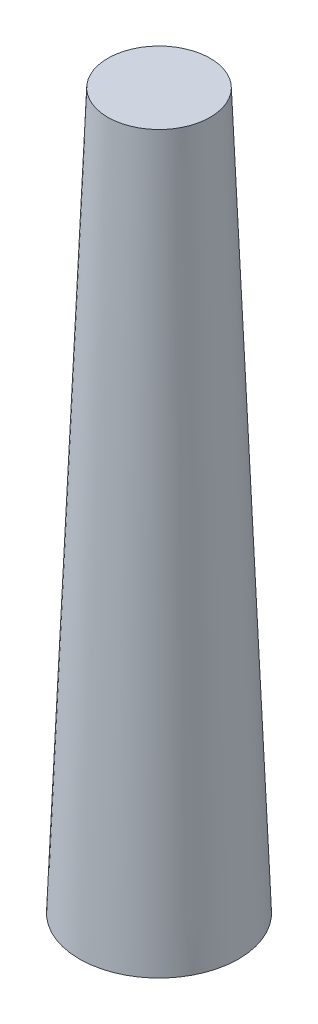
ISO-10303-21;
HEADER;
FILE_DESCRIPTION(('STEP AP214'),'2;1');
FILE_NAME('part.step','',(''),(''),'','','');
FILE_SCHEMA(('AUTOMOTIVE_DESIGN { 1 0 10303 214 1 1 1 1 }'));
ENDSEC;
DATA;
#1=APPLICATION_CONTEXT('core data for automotive mechanical design processes');
#2=APPLICATION_PROTOCOL_DEFINITION('international standard','automotive_design',2000,#1);
#3=PRODUCT_CONTEXT('',#1,'mechanical');
#4=PRODUCT('Part','Part','',(#3));
#5=PRODUCT_RELATED_PRODUCT_CATEGORY('part','',(#4));
#6=PRODUCT_DEFINITION_FORMATION('','',#4);
#7=PRODUCT_DEFINITION_CONTEXT('part definition',#1,'design');
#8=PRODUCT_DEFINITION('design','',#6,#7);
#9=PRODUCT_DEFINITION_SHAPE('','',#8);
#10=(LENGTH_UNIT() NAMED_UNIT(*) SI_UNIT(.MILLI.,.METRE.));
#11=(NAMED_UNIT(*) PLANE_ANGLE_UNIT() SI_UNIT($,.RADIAN.));
#12=(NAMED_UNIT(*) SI_UNIT($,.STERADIAN.) SOLID_ANGLE_UNIT());
#13=UNCERTAINTY_MEASURE_WITH_UNIT(LENGTH_MEASURE(1.E-05),#10,'distance_accuracy_value','');
#14=(GEOMETRIC_REPRESENTATION_CONTEXT(3) GLOBAL_UNCERTAINTY_ASSIGNED_CONTEXT((#13)) GLOBAL_UNIT_ASSIGNED_CONTEXT((#10,
#11,#12)) REPRESENTATION_CONTEXT('',''));
#15=CARTESIAN_POINT('',(0.,0.,0.));
#16=DIRECTION('',(0.,0.,1.));
#17=DIRECTION('',(1.,0.,0.));
#18=AXIS2_PLACEMENT_3D('',#15,#16,#17);
#19=CARTESIAN_POINT('',(0.,0.,0.));
#20=DIRECTION('',(0.,1.,0.));
#21=DIRECTION('',(0.,0.,1.));
#22=AXIS2_PLACEMENT_3D('',#19,#20,#21);
#23=PLANE('',#22);
#24=CARTESIAN_POINT('',(0.,0.,0.));
#25=DIRECTION('',(0.,1.,0.));
#26=DIRECTION('',(0.,0.,1.));
#27=AXIS2_PLACEMENT_3D('',#24,#25,#26);
#28=CIRCLE('',#27,1.8669);
#29=CARTESIAN_POINT('',(0.,0.,1.8669));
#30=VERTEX_POINT('',#29);
#31=EDGE_CURVE('E45',#30,#30,#28,.T.);
#32=ORIENTED_EDGE('',*,*,#31,.F.);
#33=EDGE_LOOP('',(#32));
#34=FACE_BOUND('',#33,.T.);
#35=ADVANCED_FACE('F37',(#34),#23,.F.);
#36=CARTESIAN_POINT('',(0.,16.764,0.));
#37=DIRECTION('',(0.,1.,0.));
#38=DIRECTION('',(0.,0.,1.));
#39=AXIS2_PLACEMENT_3D('',#36,#37,#38);
#40=PLANE('',#39);
#41=CARTESIAN_POINT('',(0.,16.764,0.));
#42=DIRECTION('',(0.,1.,0.));
#43=DIRECTION('',(0.,0.,1.));
#44=AXIS2_PLACEMENT_3D('',#41,#42,#43);
#45=CIRCLE('',#44,1.20015);
#46=CARTESIAN_POINT('',(0.,16.764,1.20015));
#47=VERTEX_POINT('',#46);
#48=EDGE_CURVE('E11',#47,#47,#45,.T.);
#49=ORIENTED_EDGE('',*,*,#48,.T.);
#50=EDGE_LOOP('',(#49));
#51=FACE_BOUND('',#50,.T.);
#52=ADVANCED_FACE('F85',(#51),#40,.T.);
#53=CARTESIAN_POINT('',(0.,16.764,0.));
#54=DIRECTION('',(0.,-1.,0.));
#55=DIRECTION('',(0.,0.,-1.));
#56=AXIS2_PLACEMENT_3D('',#53,#54,#55);
#57=CONICAL_SURFACE('',#56,1.20015,0.039751775395848);
#58=ORIENTED_EDGE('',*,*,#48,.F.);
#59=EDGE_LOOP('',(#58));
#60=FACE_BOUND('',#59,.T.);
#61=ORIENTED_EDGE('',*,*,#31,.T.);
#62=EDGE_LOOP('',(#61));
#63=FACE_BOUND('',#62,.T.);
#64=ADVANCED_FACE('F70',(#60,#63),#57,.T.);
#65=CLOSED_SHELL('',(#35,#52,#64));
#66=MANIFOLD_SOLID_BREP('B2',#65);
#67=ADVANCED_BREP_SHAPE_REPRESENTATION('',(#18,#66),#14);
#68=SHAPE_DEFINITION_REPRESENTATION(#9,#67);
ENDSEC;
END-ISO-10303-21;
